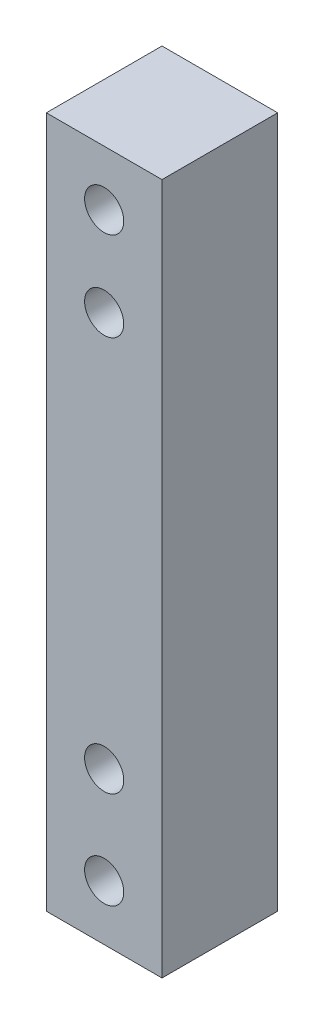
ISO-10303-21;
HEADER;
FILE_DESCRIPTION(('STEP AP214'),'2;1');
FILE_NAME('part.step','',(''),(''),'','','');
FILE_SCHEMA(('AUTOMOTIVE_DESIGN { 1 0 10303 214 1 1 1 1 }'));
ENDSEC;
DATA;
#1=APPLICATION_CONTEXT('core data for automotive mechanical design processes');
#2=APPLICATION_PROTOCOL_DEFINITION('international standard','automotive_design',2000,#1);
#3=PRODUCT_CONTEXT('',#1,'mechanical');
#4=PRODUCT('Part','Part','',(#3));
#5=PRODUCT_RELATED_PRODUCT_CATEGORY('part','',(#4));
#6=PRODUCT_DEFINITION_FORMATION('','',#4);
#7=PRODUCT_DEFINITION_CONTEXT('part definition',#1,'design');
#8=PRODUCT_DEFINITION('design','',#6,#7);
#9=PRODUCT_DEFINITION_SHAPE('','',#8);
#10=(LENGTH_UNIT() NAMED_UNIT(*) SI_UNIT(.MILLI.,.METRE.));
#11=(NAMED_UNIT(*) PLANE_ANGLE_UNIT() SI_UNIT($,.RADIAN.));
#12=(NAMED_UNIT(*) SI_UNIT($,.STERADIAN.) SOLID_ANGLE_UNIT());
#13=UNCERTAINTY_MEASURE_WITH_UNIT(LENGTH_MEASURE(1.E-05),#10,'distance_accuracy_value','');
#14=(GEOMETRIC_REPRESENTATION_CONTEXT(3) GLOBAL_UNCERTAINTY_ASSIGNED_CONTEXT((#13)) GLOBAL_UNIT_ASSIGNED_CONTEXT((#10,
#11,#12)) REPRESENTATION_CONTEXT('',''));
#15=CARTESIAN_POINT('',(0.,0.,0.));
#16=DIRECTION('',(0.,0.,1.));
#17=DIRECTION('',(1.,0.,0.));
#18=AXIS2_PLACEMENT_3D('',#15,#16,#17);
#19=CARTESIAN_POINT('',(-20.5000000000001,-205.80003589375,-13.));
#20=DIRECTION('',(1.,0.,0.));
#21=DIRECTION('',(0.,1.,0.));
#22=AXIS2_PLACEMENT_3D('',#19,#20,#21);
#23=PLANE('',#22);
#24=DIRECTION('',(0.,1.,0.));
#25=VECTOR('',#24,1.);
#26=CARTESIAN_POINT('',(-20.5000000000001,-205.80003589375,0.));
#27=LINE('',#26,#25);
#28=CARTESIAN_POINT('',(-20.5000000000001,-205.80003589375,0.));
#29=VERTEX_POINT('',#28);
#30=CARTESIAN_POINT('',(-20.5000000000001,-128.10003589375,0.));
#31=VERTEX_POINT('',#30);
#32=EDGE_CURVE('E96',#29,#31,#27,.T.);
#33=ORIENTED_EDGE('',*,*,#32,.F.);
#34=DIRECTION('',(0.,0.,1.));
#35=VECTOR('',#34,1.);
#36=CARTESIAN_POINT('',(-20.5000000000001,-205.80003589375,-13.));
#37=LINE('',#36,#35);
#38=CARTESIAN_POINT('',(-20.5000000000001,-205.80003589375,-13.));
#39=VERTEX_POINT('',#38);
#40=EDGE_CURVE('E11',#39,#29,#37,.T.);
#41=ORIENTED_EDGE('',*,*,#40,.F.);
#42=DIRECTION('',(0.,1.,0.));
#43=VECTOR('',#42,1.);
#44=CARTESIAN_POINT('',(-20.5000000000001,-205.80003589375,-13.));
#45=LINE('',#44,#43);
#46=CARTESIAN_POINT('',(-20.5000000000001,-128.10003589375,-13.));
#47=VERTEX_POINT('',#46);
#48=EDGE_CURVE('E89',#39,#47,#45,.T.);
#49=ORIENTED_EDGE('',*,*,#48,.T.);
#50=DIRECTION('',(0.,0.,1.));
#51=VECTOR('',#50,1.);
#52=CARTESIAN_POINT('',(-20.5000000000001,-128.10003589375,-13.));
#53=LINE('',#52,#51);
#54=EDGE_CURVE('E34',#47,#31,#53,.T.);
#55=ORIENTED_EDGE('',*,*,#54,.T.);
#56=EDGE_LOOP('',(#33,#41,#49,#55));
#57=FACE_BOUND('',#56,.T.);
#58=ADVANCED_FACE('F31',(#57),#23,.T.);
#59=CARTESIAN_POINT('',(-33.5000000000001,-205.80003589375,-13.));
#60=DIRECTION('',(0.,-1.,0.));
#61=DIRECTION('',(0.,0.,-1.));
#62=AXIS2_PLACEMENT_3D('',#59,#60,#61);
#63=PLANE('',#62);
#64=DIRECTION('',(1.,0.,0.));
#65=VECTOR('',#64,1.);
#66=CARTESIAN_POINT('',(-33.5000000000001,-205.80003589375,0.));
#67=LINE('',#66,#65);
#68=CARTESIAN_POINT('',(-33.5000000000001,-205.80003589375,0.));
#69=VERTEX_POINT('',#68);
#70=EDGE_CURVE('E91',#69,#29,#67,.T.);
#71=ORIENTED_EDGE('',*,*,#70,.F.);
#72=DIRECTION('',(0.,0.,1.));
#73=VECTOR('',#72,1.);
#74=CARTESIAN_POINT('',(-33.5000000000001,-205.80003589375,-13.));
#75=LINE('',#74,#73);
#76=CARTESIAN_POINT('',(-33.5000000000001,-205.80003589375,-13.));
#77=VERTEX_POINT('',#76);
#78=EDGE_CURVE('E40',#77,#69,#75,.T.);
#79=ORIENTED_EDGE('',*,*,#78,.F.);
#80=DIRECTION('',(1.,0.,0.));
#81=VECTOR('',#80,1.);
#82=CARTESIAN_POINT('',(-33.5000000000001,-205.80003589375,-13.));
#83=LINE('',#82,#81);
#84=EDGE_CURVE('E86',#77,#39,#83,.T.);
#85=ORIENTED_EDGE('',*,*,#84,.T.);
#86=ORIENTED_EDGE('',*,*,#40,.T.);
#87=EDGE_LOOP('',(#71,#79,#85,#86));
#88=FACE_BOUND('',#87,.T.);
#89=ADVANCED_FACE('F107',(#88),#63,.T.);
#90=CARTESIAN_POINT('',(-33.5000000000001,-128.10003589375,-13.));
#91=DIRECTION('',(-1.,0.,0.));
#92=DIRECTION('',(0.,-1.,0.));
#93=AXIS2_PLACEMENT_3D('',#90,#91,#92);
#94=PLANE('',#93);
#95=DIRECTION('',(0.,-1.,0.));
#96=VECTOR('',#95,1.);
#97=CARTESIAN_POINT('',(-33.5000000000001,-128.10003589375,0.));
#98=LINE('',#97,#96);
#99=CARTESIAN_POINT('',(-33.5000000000001,-128.10003589375,0.));
#100=VERTEX_POINT('',#99);
#101=EDGE_CURVE('E81',#100,#69,#98,.T.);
#102=ORIENTED_EDGE('',*,*,#101,.F.);
#103=DIRECTION('',(0.,0.,1.));
#104=VECTOR('',#103,1.);
#105=CARTESIAN_POINT('',(-33.5000000000001,-128.10003589375,-13.));
#106=LINE('',#105,#104);
#107=CARTESIAN_POINT('',(-33.5000000000001,-128.10003589375,-13.));
#108=VERTEX_POINT('',#107);
#109=EDGE_CURVE('E76',#108,#100,#106,.T.);
#110=ORIENTED_EDGE('',*,*,#109,.F.);
#111=DIRECTION('',(0.,-1.,0.));
#112=VECTOR('',#111,1.);
#113=CARTESIAN_POINT('',(-33.5000000000001,-128.10003589375,-13.));
#114=LINE('',#113,#112);
#115=EDGE_CURVE('E79',#108,#77,#114,.T.);
#116=ORIENTED_EDGE('',*,*,#115,.T.);
#117=ORIENTED_EDGE('',*,*,#78,.T.);
#118=EDGE_LOOP('',(#102,#110,#116,#117));
#119=FACE_BOUND('',#118,.T.);
#120=ADVANCED_FACE('F78',(#119),#94,.T.);
#121=CARTESIAN_POINT('',(-20.5000000000001,-128.10003589375,-13.));
#122=DIRECTION('',(0.,1.,0.));
#123=DIRECTION('',(-1.,0.,0.));
#124=AXIS2_PLACEMENT_3D('',#121,#122,#123);
#125=PLANE('',#124);
#126=DIRECTION('',(-1.,0.,0.));
#127=VECTOR('',#126,1.);
#128=CARTESIAN_POINT('',(-20.5000000000001,-128.10003589375,0.));
#129=LINE('',#128,#127);
#130=EDGE_CURVE('E99',#31,#100,#129,.T.);
#131=ORIENTED_EDGE('',*,*,#130,.F.);
#132=ORIENTED_EDGE('',*,*,#54,.F.);
#133=DIRECTION('',(-1.,0.,0.));
#134=VECTOR('',#133,1.);
#135=CARTESIAN_POINT('',(-20.5000000000001,-128.10003589375,-13.));
#136=LINE('',#135,#134);
#137=EDGE_CURVE('E85',#47,#108,#136,.T.);
#138=ORIENTED_EDGE('',*,*,#137,.T.);
#139=ORIENTED_EDGE('',*,*,#109,.T.);
#140=EDGE_LOOP('',(#131,#132,#138,#139));
#141=FACE_BOUND('',#140,.T.);
#142=ADVANCED_FACE('F88',(#141),#125,.T.);
#143=CARTESIAN_POINT('',(0.,0.,-13.));
#144=DIRECTION('',(0.,0.,1.));
#145=DIRECTION('',(1.,0.,0.));
#146=AXIS2_PLACEMENT_3D('',#143,#144,#145);
#147=PLANE('',#146);
#148=CARTESIAN_POINT('',(-27.0000000000001,-188.70003589375,-13.));
#149=DIRECTION('',(0.,0.,1.));
#150=DIRECTION('',(1.,0.,0.));
#151=AXIS2_PLACEMENT_3D('',#148,#149,#150);
#152=CIRCLE('',#151,2.20000000000001);
#153=CARTESIAN_POINT('',(-24.8000000000001,-188.70003589375,-13.));
#154=VERTEX_POINT('',#153);
#155=EDGE_CURVE('E148',#154,#154,#152,.T.);
#156=ORIENTED_EDGE('',*,*,#155,.T.);
#157=EDGE_LOOP('',(#156));
#158=FACE_BOUND('',#157,.T.);
#159=CARTESIAN_POINT('',(-27.0000000000001,-199.60003589375,-13.));
#160=DIRECTION('',(0.,0.,1.));
#161=DIRECTION('',(1.,0.,0.));
#162=AXIS2_PLACEMENT_3D('',#159,#160,#161);
#163=CIRCLE('',#162,2.19999999999998);
#164=CARTESIAN_POINT('',(-24.8000000000001,-199.60003589375,-13.));
#165=VERTEX_POINT('',#164);
#166=EDGE_CURVE('E156',#165,#165,#163,.T.);
#167=ORIENTED_EDGE('',*,*,#166,.T.);
#168=EDGE_LOOP('',(#167));
#169=FACE_BOUND('',#168,.T.);
#170=CARTESIAN_POINT('',(-27.0000000000001,-144.30003589375,-13.));
#171=DIRECTION('',(0.,0.,1.));
#172=DIRECTION('',(1.,0.,0.));
#173=AXIS2_PLACEMENT_3D('',#170,#171,#172);
#174=CIRCLE('',#173,2.20000000000001);
#175=CARTESIAN_POINT('',(-24.8000000000001,-144.30003589375,-13.));
#176=VERTEX_POINT('',#175);
#177=EDGE_CURVE('E162',#176,#176,#174,.T.);
#178=ORIENTED_EDGE('',*,*,#177,.T.);
#179=EDGE_LOOP('',(#178));
#180=FACE_BOUND('',#179,.T.);
#181=CARTESIAN_POINT('',(-27.0000000000001,-134.30003589375,-13.));
#182=DIRECTION('',(0.,0.,1.));
#183=DIRECTION('',(1.,0.,0.));
#184=AXIS2_PLACEMENT_3D('',#181,#182,#183);
#185=CIRCLE('',#184,2.19999999999998);
#186=CARTESIAN_POINT('',(-24.8000000000001,-134.30003589375,-13.));
#187=VERTEX_POINT('',#186);
#188=EDGE_CURVE('E100',#187,#187,#185,.T.);
#189=ORIENTED_EDGE('',*,*,#188,.T.);
#190=EDGE_LOOP('',(#189));
#191=FACE_BOUND('',#190,.T.);
#192=ORIENTED_EDGE('',*,*,#48,.F.);
#193=ORIENTED_EDGE('',*,*,#84,.F.);
#194=ORIENTED_EDGE('',*,*,#115,.F.);
#195=ORIENTED_EDGE('',*,*,#137,.F.);
#196=EDGE_LOOP('',(#192,#193,#194,#195));
#197=FACE_BOUND('',#196,.T.);
#198=ADVANCED_FACE('F84',(#158,#169,#180,#191,#197),#147,.F.);
#199=CARTESIAN_POINT('',(0.,0.,0.));
#200=DIRECTION('',(0.,0.,1.));
#201=DIRECTION('',(1.,0.,0.));
#202=AXIS2_PLACEMENT_3D('',#199,#200,#201);
#203=PLANE('',#202);
#204=CARTESIAN_POINT('',(-27.0000000000001,-188.70003589375,0.));
#205=DIRECTION('',(0.,0.,1.));
#206=DIRECTION('',(1.,0.,0.));
#207=AXIS2_PLACEMENT_3D('',#204,#205,#206);
#208=CIRCLE('',#207,2.20000000000001);
#209=CARTESIAN_POINT('',(-24.8000000000001,-188.70003589375,0.));
#210=VERTEX_POINT('',#209);
#211=EDGE_CURVE('E151',#210,#210,#208,.T.);
#212=ORIENTED_EDGE('',*,*,#211,.F.);
#213=EDGE_LOOP('',(#212));
#214=FACE_BOUND('',#213,.T.);
#215=CARTESIAN_POINT('',(-27.0000000000001,-199.60003589375,0.));
#216=DIRECTION('',(0.,0.,1.));
#217=DIRECTION('',(1.,0.,0.));
#218=AXIS2_PLACEMENT_3D('',#215,#216,#217);
#219=CIRCLE('',#218,2.19999999999998);
#220=CARTESIAN_POINT('',(-24.8000000000001,-199.60003589375,0.));
#221=VERTEX_POINT('',#220);
#222=EDGE_CURVE('E153',#221,#221,#219,.T.);
#223=ORIENTED_EDGE('',*,*,#222,.F.);
#224=EDGE_LOOP('',(#223));
#225=FACE_BOUND('',#224,.T.);
#226=CARTESIAN_POINT('',(-27.0000000000001,-144.30003589375,0.));
#227=DIRECTION('',(0.,0.,1.));
#228=DIRECTION('',(1.,0.,0.));
#229=AXIS2_PLACEMENT_3D('',#226,#227,#228);
#230=CIRCLE('',#229,2.20000000000001);
#231=CARTESIAN_POINT('',(-24.8000000000001,-144.30003589375,0.));
#232=VERTEX_POINT('',#231);
#233=EDGE_CURVE('E159',#232,#232,#230,.T.);
#234=ORIENTED_EDGE('',*,*,#233,.F.);
#235=EDGE_LOOP('',(#234));
#236=FACE_BOUND('',#235,.T.);
#237=CARTESIAN_POINT('',(-27.0000000000001,-134.30003589375,0.));
#238=DIRECTION('',(0.,0.,1.));
#239=DIRECTION('',(1.,0.,0.));
#240=AXIS2_PLACEMENT_3D('',#237,#238,#239);
#241=CIRCLE('',#240,2.19999999999998);
#242=CARTESIAN_POINT('',(-24.8000000000001,-134.30003589375,0.));
#243=VERTEX_POINT('',#242);
#244=EDGE_CURVE('E165',#243,#243,#241,.T.);
#245=ORIENTED_EDGE('',*,*,#244,.F.);
#246=EDGE_LOOP('',(#245));
#247=FACE_BOUND('',#246,.T.);
#248=ORIENTED_EDGE('',*,*,#32,.T.);
#249=ORIENTED_EDGE('',*,*,#130,.T.);
#250=ORIENTED_EDGE('',*,*,#101,.T.);
#251=ORIENTED_EDGE('',*,*,#70,.T.);
#252=EDGE_LOOP('',(#248,#249,#250,#251));
#253=FACE_BOUND('',#252,.T.);
#254=ADVANCED_FACE('F106',(#214,#225,#236,#247,#253),#203,.T.);
#255=CARTESIAN_POINT('',(-27.0000000000001,-134.30003589375,-13.));
#256=DIRECTION('',(0.,0.,1.));
#257=DIRECTION('',(1.,0.,0.));
#258=AXIS2_PLACEMENT_3D('',#255,#256,#257);
#259=CYLINDRICAL_SURFACE('',#258,2.19999999999998);
#260=CARTESIAN_POINT('',(-24.8000000000001,-134.30003589375,-13.));
#261=CARTESIAN_POINT('',(-24.8000000000001,-134.30003589375,-12.8645833333333));
#262=CARTESIAN_POINT('',(-24.8000000000001,-134.30003589375,-12.7291666666667));
#263=CARTESIAN_POINT('',(-24.8000000000001,-134.30003589375,-12.4583333333333));
#264=CARTESIAN_POINT('',(-24.8000000000001,-134.30003589375,-12.3229166666667));
#265=CARTESIAN_POINT('',(-24.8000000000001,-134.30003589375,-12.0520833333333));
#266=CARTESIAN_POINT('',(-24.8000000000001,-134.30003589375,-11.9166666666667));
#267=CARTESIAN_POINT('',(-24.8000000000001,-134.30003589375,-11.6458333333333));
#268=CARTESIAN_POINT('',(-24.8000000000001,-134.30003589375,-11.5104166666667));
#269=CARTESIAN_POINT('',(-24.8000000000001,-134.30003589375,-11.2395833333333));
#270=CARTESIAN_POINT('',(-24.8000000000001,-134.30003589375,-11.1041666666667));
#271=CARTESIAN_POINT('',(-24.8000000000001,-134.30003589375,-10.8333333333333));
#272=CARTESIAN_POINT('',(-24.8000000000001,-134.30003589375,-10.6979166666667));
#273=CARTESIAN_POINT('',(-24.8000000000001,-134.30003589375,-10.4270833333333));
#274=CARTESIAN_POINT('',(-24.8000000000001,-134.30003589375,-10.2916666666667));
#275=CARTESIAN_POINT('',(-24.8000000000001,-134.30003589375,-10.0208333333333));
#276=CARTESIAN_POINT('',(-24.8000000000001,-134.30003589375,-9.88541666666667));
#277=CARTESIAN_POINT('',(-24.8000000000001,-134.30003589375,-9.61458333333333));
#278=CARTESIAN_POINT('',(-24.8000000000001,-134.30003589375,-9.47916666666667));
#279=CARTESIAN_POINT('',(-24.8000000000001,-134.30003589375,-9.20833333333333));
#280=CARTESIAN_POINT('',(-24.8000000000001,-134.30003589375,-9.07291666666667));
#281=CARTESIAN_POINT('',(-24.8000000000001,-134.30003589375,-8.80208333333333));
#282=CARTESIAN_POINT('',(-24.8000000000001,-134.30003589375,-8.66666666666667));
#283=CARTESIAN_POINT('',(-24.8000000000001,-134.30003589375,-8.39583333333333));
#284=CARTESIAN_POINT('',(-24.8000000000001,-134.30003589375,-8.26041666666667));
#285=CARTESIAN_POINT('',(-24.8000000000001,-134.30003589375,-7.98958333333333));
#286=CARTESIAN_POINT('',(-24.8000000000001,-134.30003589375,-7.85416666666667));
#287=CARTESIAN_POINT('',(-24.8000000000001,-134.30003589375,-7.58333333333333));
#288=CARTESIAN_POINT('',(-24.8000000000001,-134.30003589375,-7.44791666666667));
#289=CARTESIAN_POINT('',(-24.8000000000001,-134.30003589375,-7.17708333333333));
#290=CARTESIAN_POINT('',(-24.8000000000001,-134.30003589375,-7.04166666666667));
#291=CARTESIAN_POINT('',(-24.8000000000001,-134.30003589375,-6.77083333333333));
#292=CARTESIAN_POINT('',(-24.8000000000001,-134.30003589375,-6.63541666666667));
#293=CARTESIAN_POINT('',(-24.8000000000001,-134.30003589375,-6.36458333333333));
#294=CARTESIAN_POINT('',(-24.8000000000001,-134.30003589375,-6.22916666666667));
#295=CARTESIAN_POINT('',(-24.8000000000001,-134.30003589375,-5.95833333333333));
#296=CARTESIAN_POINT('',(-24.8000000000001,-134.30003589375,-5.82291666666667));
#297=CARTESIAN_POINT('',(-24.8000000000001,-134.30003589375,-5.55208333333333));
#298=CARTESIAN_POINT('',(-24.8000000000001,-134.30003589375,-5.41666666666667));
#299=CARTESIAN_POINT('',(-24.8000000000001,-134.30003589375,-5.14583333333333));
#300=CARTESIAN_POINT('',(-24.8000000000001,-134.30003589375,-5.01041666666667));
#301=CARTESIAN_POINT('',(-24.8000000000001,-134.30003589375,-4.73958333333333));
#302=CARTESIAN_POINT('',(-24.8000000000001,-134.30003589375,-4.60416666666667));
#303=CARTESIAN_POINT('',(-24.8000000000001,-134.30003589375,-4.33333333333333));
#304=CARTESIAN_POINT('',(-24.8000000000001,-134.30003589375,-4.19791666666667));
#305=CARTESIAN_POINT('',(-24.8000000000001,-134.30003589375,-3.92708333333333));
#306=CARTESIAN_POINT('',(-24.8000000000001,-134.30003589375,-3.79166666666667));
#307=CARTESIAN_POINT('',(-24.8000000000001,-134.30003589375,-3.52083333333333));
#308=CARTESIAN_POINT('',(-24.8000000000001,-134.30003589375,-3.38541666666667));
#309=CARTESIAN_POINT('',(-24.8000000000001,-134.30003589375,-3.11458333333333));
#310=CARTESIAN_POINT('',(-24.8000000000001,-134.30003589375,-2.97916666666667));
#311=CARTESIAN_POINT('',(-24.8000000000001,-134.30003589375,-2.70833333333333));
#312=CARTESIAN_POINT('',(-24.8000000000001,-134.30003589375,-2.57291666666667));
#313=CARTESIAN_POINT('',(-24.8000000000001,-134.30003589375,-2.30208333333333));
#314=CARTESIAN_POINT('',(-24.8000000000001,-134.30003589375,-2.16666666666667));
#315=CARTESIAN_POINT('',(-24.8000000000001,-134.30003589375,-1.89583333333333));
#316=CARTESIAN_POINT('',(-24.8000000000001,-134.30003589375,-1.76041666666667));
#317=CARTESIAN_POINT('',(-24.8000000000001,-134.30003589375,-1.48958333333333));
#318=CARTESIAN_POINT('',(-24.8000000000001,-134.30003589375,-1.35416666666667));
#319=CARTESIAN_POINT('',(-24.8000000000001,-134.30003589375,-1.08333333333333));
#320=CARTESIAN_POINT('',(-24.8000000000001,-134.30003589375,-0.947916666666667));
#321=CARTESIAN_POINT('',(-24.8000000000001,-134.30003589375,-0.677083333333334));
#322=CARTESIAN_POINT('',(-24.8000000000001,-134.30003589375,-0.541666666666667));
#323=CARTESIAN_POINT('',(-24.8000000000001,-134.30003589375,-0.270833333333334));
#324=CARTESIAN_POINT('',(-24.8000000000001,-134.30003589375,-0.135416666666667));
#325=CARTESIAN_POINT('',(-24.8000000000001,-134.30003589375,0.));
#326=B_SPLINE_CURVE_WITH_KNOTS('',3,(#260,#261,#262,#263,#264,#265,#266,#267,#268,#269,#270,
#271,#272,#273,#274,#275,#276,#277,#278,#279,#280,#281,#282,#283,#284,#285,#286,#287,#288,#289,
#290,#291,#292,#293,#294,#295,#296,#297,#298,#299,#300,#301,#302,#303,#304,#305,#306,#307,#308,
#309,#310,#311,#312,#313,#314,#315,#316,#317,#318,#319,#320,#321,#322,#323,#324,#325),
.UNSPECIFIED.,.F.,.F.,(4,2,2,2,2,2,2,2,2,2,2,2,2,2,2,2,2,2,2,2,2,2,2,2,2,2,2,2,2,2,2,2,4),(0.,
0.406249999999999,0.812499999999999,1.21875,1.625,2.03125,2.4375,2.84375,3.25,3.65625,4.0625,
4.46875,4.875,5.28125,5.6875,6.09375,6.5,6.90625,7.3125,7.71875,8.125,8.53125,8.9375,9.34375,
9.75,10.15625,10.5625,10.96875,11.375,11.78125,12.1875,12.59375,13.),.UNSPECIFIED.);
#327=EDGE_CURVE('BSEAM125',#187,#243,#326,.T.);
#328=ORIENTED_EDGE('',*,*,#188,.F.);
#329=ORIENTED_EDGE('',*,*,#244,.T.);
#330=ORIENTED_EDGE('',*,*,#327,.T.);
#331=ORIENTED_EDGE('',*,*,#327,.F.);
#332=EDGE_LOOP('',(#328,#330,#329,#331));
#333=FACE_BOUND('',#332,.T.);
#334=ADVANCED_FACE('F125',(#333),#259,.F.);
#335=CARTESIAN_POINT('',(-27.0000000000001,-144.30003589375,-13.));
#336=DIRECTION('',(0.,0.,1.));
#337=DIRECTION('',(1.,0.,0.));
#338=AXIS2_PLACEMENT_3D('',#335,#336,#337);
#339=CYLINDRICAL_SURFACE('',#338,2.20000000000001);
#340=CARTESIAN_POINT('',(-24.8000000000001,-144.30003589375,-13.));
#341=CARTESIAN_POINT('',(-24.8000000000001,-144.30003589375,-12.8645833333333));
#342=CARTESIAN_POINT('',(-24.8000000000001,-144.30003589375,-12.7291666666667));
#343=CARTESIAN_POINT('',(-24.8000000000001,-144.30003589375,-12.4583333333333));
#344=CARTESIAN_POINT('',(-24.8000000000001,-144.30003589375,-12.3229166666667));
#345=CARTESIAN_POINT('',(-24.8000000000001,-144.30003589375,-12.0520833333333));
#346=CARTESIAN_POINT('',(-24.8000000000001,-144.30003589375,-11.9166666666667));
#347=CARTESIAN_POINT('',(-24.8000000000001,-144.30003589375,-11.6458333333333));
#348=CARTESIAN_POINT('',(-24.8000000000001,-144.30003589375,-11.5104166666667));
#349=CARTESIAN_POINT('',(-24.8000000000001,-144.30003589375,-11.2395833333333));
#350=CARTESIAN_POINT('',(-24.8000000000001,-144.30003589375,-11.1041666666667));
#351=CARTESIAN_POINT('',(-24.8000000000001,-144.30003589375,-10.8333333333333));
#352=CARTESIAN_POINT('',(-24.8000000000001,-144.30003589375,-10.6979166666667));
#353=CARTESIAN_POINT('',(-24.8000000000001,-144.30003589375,-10.4270833333333));
#354=CARTESIAN_POINT('',(-24.8000000000001,-144.30003589375,-10.2916666666667));
#355=CARTESIAN_POINT('',(-24.8000000000001,-144.30003589375,-10.0208333333333));
#356=CARTESIAN_POINT('',(-24.8000000000001,-144.30003589375,-9.88541666666667));
#357=CARTESIAN_POINT('',(-24.8000000000001,-144.30003589375,-9.61458333333333));
#358=CARTESIAN_POINT('',(-24.8000000000001,-144.30003589375,-9.47916666666667));
#359=CARTESIAN_POINT('',(-24.8000000000001,-144.30003589375,-9.20833333333333));
#360=CARTESIAN_POINT('',(-24.8000000000001,-144.30003589375,-9.07291666666667));
#361=CARTESIAN_POINT('',(-24.8000000000001,-144.30003589375,-8.80208333333333));
#362=CARTESIAN_POINT('',(-24.8000000000001,-144.30003589375,-8.66666666666667));
#363=CARTESIAN_POINT('',(-24.8000000000001,-144.30003589375,-8.39583333333333));
#364=CARTESIAN_POINT('',(-24.8000000000001,-144.30003589375,-8.26041666666667));
#365=CARTESIAN_POINT('',(-24.8000000000001,-144.30003589375,-7.98958333333333));
#366=CARTESIAN_POINT('',(-24.8000000000001,-144.30003589375,-7.85416666666667));
#367=CARTESIAN_POINT('',(-24.8000000000001,-144.30003589375,-7.58333333333333));
#368=CARTESIAN_POINT('',(-24.8000000000001,-144.30003589375,-7.44791666666667));
#369=CARTESIAN_POINT('',(-24.8000000000001,-144.30003589375,-7.17708333333333));
#370=CARTESIAN_POINT('',(-24.8000000000001,-144.30003589375,-7.04166666666667));
#371=CARTESIAN_POINT('',(-24.8000000000001,-144.30003589375,-6.77083333333333));
#372=CARTESIAN_POINT('',(-24.8000000000001,-144.30003589375,-6.63541666666667));
#373=CARTESIAN_POINT('',(-24.8000000000001,-144.30003589375,-6.36458333333333));
#374=CARTESIAN_POINT('',(-24.8000000000001,-144.30003589375,-6.22916666666667));
#375=CARTESIAN_POINT('',(-24.8000000000001,-144.30003589375,-5.95833333333333));
#376=CARTESIAN_POINT('',(-24.8000000000001,-144.30003589375,-5.82291666666667));
#377=CARTESIAN_POINT('',(-24.8000000000001,-144.30003589375,-5.55208333333333));
#378=CARTESIAN_POINT('',(-24.8000000000001,-144.30003589375,-5.41666666666667));
#379=CARTESIAN_POINT('',(-24.8000000000001,-144.30003589375,-5.14583333333333));
#380=CARTESIAN_POINT('',(-24.8000000000001,-144.30003589375,-5.01041666666667));
#381=CARTESIAN_POINT('',(-24.8000000000001,-144.30003589375,-4.73958333333333));
#382=CARTESIAN_POINT('',(-24.8000000000001,-144.30003589375,-4.60416666666667));
#383=CARTESIAN_POINT('',(-24.8000000000001,-144.30003589375,-4.33333333333333));
#384=CARTESIAN_POINT('',(-24.8000000000001,-144.30003589375,-4.19791666666667));
#385=CARTESIAN_POINT('',(-24.8000000000001,-144.30003589375,-3.92708333333333));
#386=CARTESIAN_POINT('',(-24.8000000000001,-144.30003589375,-3.79166666666667));
#387=CARTESIAN_POINT('',(-24.8000000000001,-144.30003589375,-3.52083333333333));
#388=CARTESIAN_POINT('',(-24.8000000000001,-144.30003589375,-3.38541666666667));
#389=CARTESIAN_POINT('',(-24.8000000000001,-144.30003589375,-3.11458333333333));
#390=CARTESIAN_POINT('',(-24.8000000000001,-144.30003589375,-2.97916666666667));
#391=CARTESIAN_POINT('',(-24.8000000000001,-144.30003589375,-2.70833333333333));
#392=CARTESIAN_POINT('',(-24.8000000000001,-144.30003589375,-2.57291666666667));
#393=CARTESIAN_POINT('',(-24.8000000000001,-144.30003589375,-2.30208333333333));
#394=CARTESIAN_POINT('',(-24.8000000000001,-144.30003589375,-2.16666666666667));
#395=CARTESIAN_POINT('',(-24.8000000000001,-144.30003589375,-1.89583333333333));
#396=CARTESIAN_POINT('',(-24.8000000000001,-144.30003589375,-1.76041666666667));
#397=CARTESIAN_POINT('',(-24.8000000000001,-144.30003589375,-1.48958333333333));
#398=CARTESIAN_POINT('',(-24.8000000000001,-144.30003589375,-1.35416666666667));
#399=CARTESIAN_POINT('',(-24.8000000000001,-144.30003589375,-1.08333333333333));
#400=CARTESIAN_POINT('',(-24.8000000000001,-144.30003589375,-0.947916666666667));
#401=CARTESIAN_POINT('',(-24.8000000000001,-144.30003589375,-0.677083333333334));
#402=CARTESIAN_POINT('',(-24.8000000000001,-144.30003589375,-0.541666666666667));
#403=CARTESIAN_POINT('',(-24.8000000000001,-144.30003589375,-0.270833333333334));
#404=CARTESIAN_POINT('',(-24.8000000000001,-144.30003589375,-0.135416666666667));
#405=CARTESIAN_POINT('',(-24.8000000000001,-144.30003589375,0.));
#406=B_SPLINE_CURVE_WITH_KNOTS('',3,(#340,#341,#342,#343,#344,#345,#346,#347,#348,#349,#350,
#351,#352,#353,#354,#355,#356,#357,#358,#359,#360,#361,#362,#363,#364,#365,#366,#367,#368,#369,
#370,#371,#372,#373,#374,#375,#376,#377,#378,#379,#380,#381,#382,#383,#384,#385,#386,#387,#388,
#389,#390,#391,#392,#393,#394,#395,#396,#397,#398,#399,#400,#401,#402,#403,#404,#405),
.UNSPECIFIED.,.F.,.F.,(4,2,2,2,2,2,2,2,2,2,2,2,2,2,2,2,2,2,2,2,2,2,2,2,2,2,2,2,2,2,2,2,4),(0.,
0.406249999999999,0.812499999999999,1.21875,1.625,2.03125,2.4375,2.84375,3.25,3.65625,4.0625,
4.46875,4.875,5.28125,5.6875,6.09375,6.5,6.90625,7.3125,7.71875,8.125,8.53125,8.9375,9.34375,
9.75,10.15625,10.5625,10.96875,11.375,11.78125,12.1875,12.59375,13.),.UNSPECIFIED.);
#407=EDGE_CURVE('BSEAM132',#176,#232,#406,.T.);
#408=ORIENTED_EDGE('',*,*,#177,.F.);
#409=ORIENTED_EDGE('',*,*,#233,.T.);
#410=ORIENTED_EDGE('',*,*,#407,.T.);
#411=ORIENTED_EDGE('',*,*,#407,.F.);
#412=EDGE_LOOP('',(#408,#410,#409,#411));
#413=FACE_BOUND('',#412,.T.);
#414=ADVANCED_FACE('F132',(#413),#339,.F.);
#415=CARTESIAN_POINT('',(-27.0000000000001,-199.60003589375,-13.));
#416=DIRECTION('',(0.,0.,1.));
#417=DIRECTION('',(1.,0.,0.));
#418=AXIS2_PLACEMENT_3D('',#415,#416,#417);
#419=CYLINDRICAL_SURFACE('',#418,2.19999999999998);
#420=CARTESIAN_POINT('',(-24.8000000000001,-199.60003589375,-13.));
#421=CARTESIAN_POINT('',(-24.8000000000001,-199.60003589375,-12.8645833333333));
#422=CARTESIAN_POINT('',(-24.8000000000001,-199.60003589375,-12.7291666666667));
#423=CARTESIAN_POINT('',(-24.8000000000001,-199.60003589375,-12.4583333333333));
#424=CARTESIAN_POINT('',(-24.8000000000001,-199.60003589375,-12.3229166666667));
#425=CARTESIAN_POINT('',(-24.8000000000001,-199.60003589375,-12.0520833333333));
#426=CARTESIAN_POINT('',(-24.8000000000001,-199.60003589375,-11.9166666666667));
#427=CARTESIAN_POINT('',(-24.8000000000001,-199.60003589375,-11.6458333333333));
#428=CARTESIAN_POINT('',(-24.8000000000001,-199.60003589375,-11.5104166666667));
#429=CARTESIAN_POINT('',(-24.8000000000001,-199.60003589375,-11.2395833333333));
#430=CARTESIAN_POINT('',(-24.8000000000001,-199.60003589375,-11.1041666666667));
#431=CARTESIAN_POINT('',(-24.8000000000001,-199.60003589375,-10.8333333333333));
#432=CARTESIAN_POINT('',(-24.8000000000001,-199.60003589375,-10.6979166666667));
#433=CARTESIAN_POINT('',(-24.8000000000001,-199.60003589375,-10.4270833333333));
#434=CARTESIAN_POINT('',(-24.8000000000001,-199.60003589375,-10.2916666666667));
#435=CARTESIAN_POINT('',(-24.8000000000001,-199.60003589375,-10.0208333333333));
#436=CARTESIAN_POINT('',(-24.8000000000001,-199.60003589375,-9.88541666666667));
#437=CARTESIAN_POINT('',(-24.8000000000001,-199.60003589375,-9.61458333333333));
#438=CARTESIAN_POINT('',(-24.8000000000001,-199.60003589375,-9.47916666666667));
#439=CARTESIAN_POINT('',(-24.8000000000001,-199.60003589375,-9.20833333333333));
#440=CARTESIAN_POINT('',(-24.8000000000001,-199.60003589375,-9.07291666666667));
#441=CARTESIAN_POINT('',(-24.8000000000001,-199.60003589375,-8.80208333333333));
#442=CARTESIAN_POINT('',(-24.8000000000001,-199.60003589375,-8.66666666666667));
#443=CARTESIAN_POINT('',(-24.8000000000001,-199.60003589375,-8.39583333333333));
#444=CARTESIAN_POINT('',(-24.8000000000001,-199.60003589375,-8.26041666666667));
#445=CARTESIAN_POINT('',(-24.8000000000001,-199.60003589375,-7.98958333333333));
#446=CARTESIAN_POINT('',(-24.8000000000001,-199.60003589375,-7.85416666666667));
#447=CARTESIAN_POINT('',(-24.8000000000001,-199.60003589375,-7.58333333333333));
#448=CARTESIAN_POINT('',(-24.8000000000001,-199.60003589375,-7.44791666666667));
#449=CARTESIAN_POINT('',(-24.8000000000001,-199.60003589375,-7.17708333333333));
#450=CARTESIAN_POINT('',(-24.8000000000001,-199.60003589375,-7.04166666666667));
#451=CARTESIAN_POINT('',(-24.8000000000001,-199.60003589375,-6.77083333333333));
#452=CARTESIAN_POINT('',(-24.8000000000001,-199.60003589375,-6.63541666666667));
#453=CARTESIAN_POINT('',(-24.8000000000001,-199.60003589375,-6.36458333333333));
#454=CARTESIAN_POINT('',(-24.8000000000001,-199.60003589375,-6.22916666666667));
#455=CARTESIAN_POINT('',(-24.8000000000001,-199.60003589375,-5.95833333333333));
#456=CARTESIAN_POINT('',(-24.8000000000001,-199.60003589375,-5.82291666666667));
#457=CARTESIAN_POINT('',(-24.8000000000001,-199.60003589375,-5.55208333333333));
#458=CARTESIAN_POINT('',(-24.8000000000001,-199.60003589375,-5.41666666666667));
#459=CARTESIAN_POINT('',(-24.8000000000001,-199.60003589375,-5.14583333333333));
#460=CARTESIAN_POINT('',(-24.8000000000001,-199.60003589375,-5.01041666666667));
#461=CARTESIAN_POINT('',(-24.8000000000001,-199.60003589375,-4.73958333333333));
#462=CARTESIAN_POINT('',(-24.8000000000001,-199.60003589375,-4.60416666666667));
#463=CARTESIAN_POINT('',(-24.8000000000001,-199.60003589375,-4.33333333333333));
#464=CARTESIAN_POINT('',(-24.8000000000001,-199.60003589375,-4.19791666666667));
#465=CARTESIAN_POINT('',(-24.8000000000001,-199.60003589375,-3.92708333333333));
#466=CARTESIAN_POINT('',(-24.8000000000001,-199.60003589375,-3.79166666666667));
#467=CARTESIAN_POINT('',(-24.8000000000001,-199.60003589375,-3.52083333333333));
#468=CARTESIAN_POINT('',(-24.8000000000001,-199.60003589375,-3.38541666666667));
#469=CARTESIAN_POINT('',(-24.8000000000001,-199.60003589375,-3.11458333333333));
#470=CARTESIAN_POINT('',(-24.8000000000001,-199.60003589375,-2.97916666666667));
#471=CARTESIAN_POINT('',(-24.8000000000001,-199.60003589375,-2.70833333333333));
#472=CARTESIAN_POINT('',(-24.8000000000001,-199.60003589375,-2.57291666666667));
#473=CARTESIAN_POINT('',(-24.8000000000001,-199.60003589375,-2.30208333333333));
#474=CARTESIAN_POINT('',(-24.8000000000001,-199.60003589375,-2.16666666666667));
#475=CARTESIAN_POINT('',(-24.8000000000001,-199.60003589375,-1.89583333333333));
#476=CARTESIAN_POINT('',(-24.8000000000001,-199.60003589375,-1.76041666666667));
#477=CARTESIAN_POINT('',(-24.8000000000001,-199.60003589375,-1.48958333333333));
#478=CARTESIAN_POINT('',(-24.8000000000001,-199.60003589375,-1.35416666666667));
#479=CARTESIAN_POINT('',(-24.8000000000001,-199.60003589375,-1.08333333333333));
#480=CARTESIAN_POINT('',(-24.8000000000001,-199.60003589375,-0.947916666666667));
#481=CARTESIAN_POINT('',(-24.8000000000001,-199.60003589375,-0.677083333333334));
#482=CARTESIAN_POINT('',(-24.8000000000001,-199.60003589375,-0.541666666666667));
#483=CARTESIAN_POINT('',(-24.8000000000001,-199.60003589375,-0.270833333333334));
#484=CARTESIAN_POINT('',(-24.8000000000001,-199.60003589375,-0.135416666666667));
#485=CARTESIAN_POINT('',(-24.8000000000001,-199.60003589375,0.));
#486=B_SPLINE_CURVE_WITH_KNOTS('',3,(#420,#421,#422,#423,#424,#425,#426,#427,#428,#429,#430,
#431,#432,#433,#434,#435,#436,#437,#438,#439,#440,#441,#442,#443,#444,#445,#446,#447,#448,#449,
#450,#451,#452,#453,#454,#455,#456,#457,#458,#459,#460,#461,#462,#463,#464,#465,#466,#467,#468,
#469,#470,#471,#472,#473,#474,#475,#476,#477,#478,#479,#480,#481,#482,#483,#484,#485),
.UNSPECIFIED.,.F.,.F.,(4,2,2,2,2,2,2,2,2,2,2,2,2,2,2,2,2,2,2,2,2,2,2,2,2,2,2,2,2,2,2,2,4),(0.,
0.406249999999999,0.812499999999999,1.21875,1.625,2.03125,2.4375,2.84375,3.25,3.65625,4.0625,
4.46875,4.875,5.28125,5.6875,6.09375,6.5,6.90625,7.3125,7.71875,8.125,8.53125,8.9375,9.34375,
9.75,10.15625,10.5625,10.96875,11.375,11.78125,12.1875,12.59375,13.),.UNSPECIFIED.);
#487=EDGE_CURVE('BSEAM136',#165,#221,#486,.T.);
#488=ORIENTED_EDGE('',*,*,#166,.F.);
#489=ORIENTED_EDGE('',*,*,#222,.T.);
#490=ORIENTED_EDGE('',*,*,#487,.T.);
#491=ORIENTED_EDGE('',*,*,#487,.F.);
#492=EDGE_LOOP('',(#488,#490,#489,#491));
#493=FACE_BOUND('',#492,.T.);
#494=ADVANCED_FACE('F136',(#493),#419,.F.);
#495=CARTESIAN_POINT('',(-27.0000000000001,-188.70003589375,-13.));
#496=DIRECTION('',(0.,0.,1.));
#497=DIRECTION('',(1.,0.,0.));
#498=AXIS2_PLACEMENT_3D('',#495,#496,#497);
#499=CYLINDRICAL_SURFACE('',#498,2.20000000000001);
#500=CARTESIAN_POINT('',(-24.8000000000001,-188.70003589375,-13.));
#501=CARTESIAN_POINT('',(-24.8000000000001,-188.70003589375,-12.8645833333333));
#502=CARTESIAN_POINT('',(-24.8000000000001,-188.70003589375,-12.7291666666667));
#503=CARTESIAN_POINT('',(-24.8000000000001,-188.70003589375,-12.4583333333333));
#504=CARTESIAN_POINT('',(-24.8000000000001,-188.70003589375,-12.3229166666667));
#505=CARTESIAN_POINT('',(-24.8000000000001,-188.70003589375,-12.0520833333333));
#506=CARTESIAN_POINT('',(-24.8000000000001,-188.70003589375,-11.9166666666667));
#507=CARTESIAN_POINT('',(-24.8000000000001,-188.70003589375,-11.6458333333333));
#508=CARTESIAN_POINT('',(-24.8000000000001,-188.70003589375,-11.5104166666667));
#509=CARTESIAN_POINT('',(-24.8000000000001,-188.70003589375,-11.2395833333333));
#510=CARTESIAN_POINT('',(-24.8000000000001,-188.70003589375,-11.1041666666667));
#511=CARTESIAN_POINT('',(-24.8000000000001,-188.70003589375,-10.8333333333333));
#512=CARTESIAN_POINT('',(-24.8000000000001,-188.70003589375,-10.6979166666667));
#513=CARTESIAN_POINT('',(-24.8000000000001,-188.70003589375,-10.4270833333333));
#514=CARTESIAN_POINT('',(-24.8000000000001,-188.70003589375,-10.2916666666667));
#515=CARTESIAN_POINT('',(-24.8000000000001,-188.70003589375,-10.0208333333333));
#516=CARTESIAN_POINT('',(-24.8000000000001,-188.70003589375,-9.88541666666667));
#517=CARTESIAN_POINT('',(-24.8000000000001,-188.70003589375,-9.61458333333333));
#518=CARTESIAN_POINT('',(-24.8000000000001,-188.70003589375,-9.47916666666667));
#519=CARTESIAN_POINT('',(-24.8000000000001,-188.70003589375,-9.20833333333333));
#520=CARTESIAN_POINT('',(-24.8000000000001,-188.70003589375,-9.07291666666667));
#521=CARTESIAN_POINT('',(-24.8000000000001,-188.70003589375,-8.80208333333333));
#522=CARTESIAN_POINT('',(-24.8000000000001,-188.70003589375,-8.66666666666667));
#523=CARTESIAN_POINT('',(-24.8000000000001,-188.70003589375,-8.39583333333333));
#524=CARTESIAN_POINT('',(-24.8000000000001,-188.70003589375,-8.26041666666667));
#525=CARTESIAN_POINT('',(-24.8000000000001,-188.70003589375,-7.98958333333333));
#526=CARTESIAN_POINT('',(-24.8000000000001,-188.70003589375,-7.85416666666667));
#527=CARTESIAN_POINT('',(-24.8000000000001,-188.70003589375,-7.58333333333333));
#528=CARTESIAN_POINT('',(-24.8000000000001,-188.70003589375,-7.44791666666667));
#529=CARTESIAN_POINT('',(-24.8000000000001,-188.70003589375,-7.17708333333333));
#530=CARTESIAN_POINT('',(-24.8000000000001,-188.70003589375,-7.04166666666667));
#531=CARTESIAN_POINT('',(-24.8000000000001,-188.70003589375,-6.77083333333333));
#532=CARTESIAN_POINT('',(-24.8000000000001,-188.70003589375,-6.63541666666667));
#533=CARTESIAN_POINT('',(-24.8000000000001,-188.70003589375,-6.36458333333333));
#534=CARTESIAN_POINT('',(-24.8000000000001,-188.70003589375,-6.22916666666667));
#535=CARTESIAN_POINT('',(-24.8000000000001,-188.70003589375,-5.95833333333333));
#536=CARTESIAN_POINT('',(-24.8000000000001,-188.70003589375,-5.82291666666667));
#537=CARTESIAN_POINT('',(-24.8000000000001,-188.70003589375,-5.55208333333333));
#538=CARTESIAN_POINT('',(-24.8000000000001,-188.70003589375,-5.41666666666667));
#539=CARTESIAN_POINT('',(-24.8000000000001,-188.70003589375,-5.14583333333333));
#540=CARTESIAN_POINT('',(-24.8000000000001,-188.70003589375,-5.01041666666667));
#541=CARTESIAN_POINT('',(-24.8000000000001,-188.70003589375,-4.73958333333333));
#542=CARTESIAN_POINT('',(-24.8000000000001,-188.70003589375,-4.60416666666667));
#543=CARTESIAN_POINT('',(-24.8000000000001,-188.70003589375,-4.33333333333333));
#544=CARTESIAN_POINT('',(-24.8000000000001,-188.70003589375,-4.19791666666667));
#545=CARTESIAN_POINT('',(-24.8000000000001,-188.70003589375,-3.92708333333333));
#546=CARTESIAN_POINT('',(-24.8000000000001,-188.70003589375,-3.79166666666667));
#547=CARTESIAN_POINT('',(-24.8000000000001,-188.70003589375,-3.52083333333333));
#548=CARTESIAN_POINT('',(-24.8000000000001,-188.70003589375,-3.38541666666667));
#549=CARTESIAN_POINT('',(-24.8000000000001,-188.70003589375,-3.11458333333333));
#550=CARTESIAN_POINT('',(-24.8000000000001,-188.70003589375,-2.97916666666667));
#551=CARTESIAN_POINT('',(-24.8000000000001,-188.70003589375,-2.70833333333333));
#552=CARTESIAN_POINT('',(-24.8000000000001,-188.70003589375,-2.57291666666667));
#553=CARTESIAN_POINT('',(-24.8000000000001,-188.70003589375,-2.30208333333333));
#554=CARTESIAN_POINT('',(-24.8000000000001,-188.70003589375,-2.16666666666667));
#555=CARTESIAN_POINT('',(-24.8000000000001,-188.70003589375,-1.89583333333333));
#556=CARTESIAN_POINT('',(-24.8000000000001,-188.70003589375,-1.76041666666667));
#557=CARTESIAN_POINT('',(-24.8000000000001,-188.70003589375,-1.48958333333333));
#558=CARTESIAN_POINT('',(-24.8000000000001,-188.70003589375,-1.35416666666667));
#559=CARTESIAN_POINT('',(-24.8000000000001,-188.70003589375,-1.08333333333333));
#560=CARTESIAN_POINT('',(-24.8000000000001,-188.70003589375,-0.947916666666667));
#561=CARTESIAN_POINT('',(-24.8000000000001,-188.70003589375,-0.677083333333334));
#562=CARTESIAN_POINT('',(-24.8000000000001,-188.70003589375,-0.541666666666667));
#563=CARTESIAN_POINT('',(-24.8000000000001,-188.70003589375,-0.270833333333334));
#564=CARTESIAN_POINT('',(-24.8000000000001,-188.70003589375,-0.135416666666667));
#565=CARTESIAN_POINT('',(-24.8000000000001,-188.70003589375,0.));
#566=B_SPLINE_CURVE_WITH_KNOTS('',3,(#500,#501,#502,#503,#504,#505,#506,#507,#508,#509,#510,
#511,#512,#513,#514,#515,#516,#517,#518,#519,#520,#521,#522,#523,#524,#525,#526,#527,#528,#529,
#530,#531,#532,#533,#534,#535,#536,#537,#538,#539,#540,#541,#542,#543,#544,#545,#546,#547,#548,
#549,#550,#551,#552,#553,#554,#555,#556,#557,#558,#559,#560,#561,#562,#563,#564,#565),
.UNSPECIFIED.,.F.,.F.,(4,2,2,2,2,2,2,2,2,2,2,2,2,2,2,2,2,2,2,2,2,2,2,2,2,2,2,2,2,2,2,2,4),(0.,
0.406249999999999,0.812499999999999,1.21875,1.625,2.03125,2.4375,2.84375,3.25,3.65625,4.0625,
4.46875,4.875,5.28125,5.6875,6.09375,6.5,6.90625,7.3125,7.71875,8.125,8.53125,8.9375,9.34375,
9.75,10.15625,10.5625,10.96875,11.375,11.78125,12.1875,12.59375,13.),.UNSPECIFIED.);
#567=EDGE_CURVE('BSEAM140',#154,#210,#566,.T.);
#568=ORIENTED_EDGE('',*,*,#155,.F.);
#569=ORIENTED_EDGE('',*,*,#211,.T.);
#570=ORIENTED_EDGE('',*,*,#567,.T.);
#571=ORIENTED_EDGE('',*,*,#567,.F.);
#572=EDGE_LOOP('',(#568,#570,#569,#571));
#573=FACE_BOUND('',#572,.T.);
#574=ADVANCED_FACE('F140',(#573),#499,.F.);
#575=CLOSED_SHELL('',(#58,#89,#120,#142,#198,#254,#334,#414,#494,#574));
#576=MANIFOLD_SOLID_BREP('B2',#575);
#577=ADVANCED_BREP_SHAPE_REPRESENTATION('',(#18,#576),#14);
#578=SHAPE_DEFINITION_REPRESENTATION(#9,#577);
ENDSEC;
END-ISO-10303-21;
